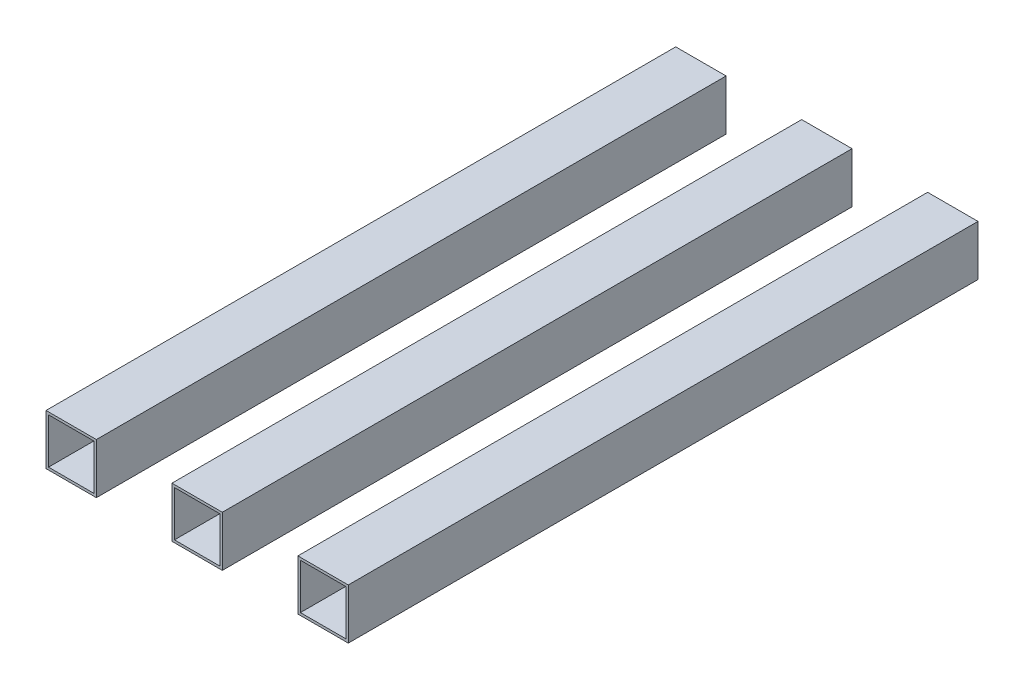
ISO-10303-21;
HEADER;
FILE_DESCRIPTION(('STEP AP214'),'2;1');
FILE_NAME('part.step','',(''),(''),'','','');
FILE_SCHEMA(('AUTOMOTIVE_DESIGN { 1 0 10303 214 1 1 1 1 }'));
ENDSEC;
DATA;
#1=APPLICATION_CONTEXT('core data for automotive mechanical design processes');
#2=APPLICATION_PROTOCOL_DEFINITION('international standard','automotive_design',2000,#1);
#3=PRODUCT_CONTEXT('',#1,'mechanical');
#4=PRODUCT('Part','Part','',(#3));
#5=PRODUCT_RELATED_PRODUCT_CATEGORY('part','',(#4));
#6=PRODUCT_DEFINITION_FORMATION('','',#4);
#7=PRODUCT_DEFINITION_CONTEXT('part definition',#1,'design');
#8=PRODUCT_DEFINITION('design','',#6,#7);
#9=PRODUCT_DEFINITION_SHAPE('','',#8);
#10=(LENGTH_UNIT() NAMED_UNIT(*) SI_UNIT(.MILLI.,.METRE.));
#11=(NAMED_UNIT(*) PLANE_ANGLE_UNIT() SI_UNIT($,.RADIAN.));
#12=(NAMED_UNIT(*) SI_UNIT($,.STERADIAN.) SOLID_ANGLE_UNIT());
#13=UNCERTAINTY_MEASURE_WITH_UNIT(LENGTH_MEASURE(1.E-05),#10,'distance_accuracy_value','');
#14=(GEOMETRIC_REPRESENTATION_CONTEXT(3) GLOBAL_UNCERTAINTY_ASSIGNED_CONTEXT((#13)) GLOBAL_UNIT_ASSIGNED_CONTEXT((#10,
#11,#12)) REPRESENTATION_CONTEXT('',''));
#15=CARTESIAN_POINT('',(0.,0.,0.));
#16=DIRECTION('',(0.,0.,1.));
#17=DIRECTION('',(1.,0.,0.));
#18=AXIS2_PLACEMENT_3D('',#15,#16,#17);
#19=CARTESIAN_POINT('',(0.,0.,500.));
#20=DIRECTION('',(0.,0.,-1.));
#21=DIRECTION('',(-1.,0.,0.));
#22=AXIS2_PLACEMENT_3D('',#19,#20,#21);
#23=PLANE('',#22);
#24=DIRECTION('',(0.,-1.,0.));
#25=VECTOR('',#24,1.);
#26=CARTESIAN_POINT('',(80.,-20.,500.));
#27=LINE('',#26,#25);
#28=CARTESIAN_POINT('',(80.,20.,500.));
#29=VERTEX_POINT('',#28);
#30=CARTESIAN_POINT('',(80.,-20.,500.));
#31=VERTEX_POINT('',#30);
#32=EDGE_CURVE('E151',#29,#31,#27,.T.);
#33=ORIENTED_EDGE('',*,*,#32,.T.);
#34=DIRECTION('',(1.,0.,0.));
#35=VECTOR('',#34,1.);
#36=CARTESIAN_POINT('',(80.,-20.,500.));
#37=LINE('',#36,#35);
#38=CARTESIAN_POINT('',(120.,-20.,500.));
#39=VERTEX_POINT('',#38);
#40=EDGE_CURVE('E154',#31,#39,#37,.T.);
#41=ORIENTED_EDGE('',*,*,#40,.T.);
#42=DIRECTION('',(0.,1.,0.));
#43=VECTOR('',#42,1.);
#44=CARTESIAN_POINT('',(120.,-20.,500.));
#45=LINE('',#44,#43);
#46=CARTESIAN_POINT('',(120.,20.,500.));
#47=VERTEX_POINT('',#46);
#48=EDGE_CURVE('E157',#39,#47,#45,.T.);
#49=ORIENTED_EDGE('',*,*,#48,.T.);
#50=DIRECTION('',(-1.,0.,0.));
#51=VECTOR('',#50,1.);
#52=CARTESIAN_POINT('',(80.,20.,500.));
#53=LINE('',#52,#51);
#54=EDGE_CURVE('E159',#47,#29,#53,.T.);
#55=ORIENTED_EDGE('',*,*,#54,.T.);
#56=EDGE_LOOP('',(#33,#41,#49,#55));
#57=FACE_BOUND('',#56,.T.);
#58=DIRECTION('',(0.,-1.,0.));
#59=VECTOR('',#58,1.);
#60=CARTESIAN_POINT('',(82.,-18.,500.));
#61=LINE('',#60,#59);
#62=CARTESIAN_POINT('',(82.,18.,500.));
#63=VERTEX_POINT('',#62);
#64=CARTESIAN_POINT('',(82.,-18.,500.));
#65=VERTEX_POINT('',#64);
#66=EDGE_CURVE('E115',#63,#65,#61,.T.);
#67=ORIENTED_EDGE('',*,*,#66,.F.);
#68=DIRECTION('',(-1.,0.,0.));
#69=VECTOR('',#68,1.);
#70=CARTESIAN_POINT('',(82.,18.,500.));
#71=LINE('',#70,#69);
#72=CARTESIAN_POINT('',(118.,18.,500.));
#73=VERTEX_POINT('',#72);
#74=EDGE_CURVE('E137',#73,#63,#71,.T.);
#75=ORIENTED_EDGE('',*,*,#74,.F.);
#76=DIRECTION('',(0.,1.,0.));
#77=VECTOR('',#76,1.);
#78=CARTESIAN_POINT('',(118.,-18.,500.));
#79=LINE('',#78,#77);
#80=CARTESIAN_POINT('',(118.,-18.,500.));
#81=VERTEX_POINT('',#80);
#82=EDGE_CURVE('E135',#81,#73,#79,.T.);
#83=ORIENTED_EDGE('',*,*,#82,.F.);
#84=DIRECTION('',(1.,0.,0.));
#85=VECTOR('',#84,1.);
#86=CARTESIAN_POINT('',(82.,-18.,500.));
#87=LINE('',#86,#85);
#88=EDGE_CURVE('E123',#65,#81,#87,.T.);
#89=ORIENTED_EDGE('',*,*,#88,.F.);
#90=EDGE_LOOP('',(#67,#75,#83,#89));
#91=FACE_BOUND('',#90,.T.);
#92=ADVANCED_FACE('F50',(#57,#91),#23,.F.);
#93=CARTESIAN_POINT('',(0.,0.,0.));
#94=DIRECTION('',(0.,0.,-1.));
#95=DIRECTION('',(-1.,0.,0.));
#96=AXIS2_PLACEMENT_3D('',#93,#94,#95);
#97=PLANE('',#96);
#98=DIRECTION('',(0.,-1.,0.));
#99=VECTOR('',#98,1.);
#100=CARTESIAN_POINT('',(80.,-20.,0.));
#101=LINE('',#100,#99);
#102=CARTESIAN_POINT('',(80.,20.,0.));
#103=VERTEX_POINT('',#102);
#104=CARTESIAN_POINT('',(80.,-20.,0.));
#105=VERTEX_POINT('',#104);
#106=EDGE_CURVE('E131',#103,#105,#101,.T.);
#107=ORIENTED_EDGE('',*,*,#106,.F.);
#108=DIRECTION('',(-1.,0.,0.));
#109=VECTOR('',#108,1.);
#110=CARTESIAN_POINT('',(80.,20.,0.));
#111=LINE('',#110,#109);
#112=CARTESIAN_POINT('',(120.,20.,0.));
#113=VERTEX_POINT('',#112);
#114=EDGE_CURVE('E155',#113,#103,#111,.T.);
#115=ORIENTED_EDGE('',*,*,#114,.F.);
#116=DIRECTION('',(0.,1.,0.));
#117=VECTOR('',#116,1.);
#118=CARTESIAN_POINT('',(120.,-20.,0.));
#119=LINE('',#118,#117);
#120=CARTESIAN_POINT('',(120.,-20.,0.));
#121=VERTEX_POINT('',#120);
#122=EDGE_CURVE('E166',#121,#113,#119,.T.);
#123=ORIENTED_EDGE('',*,*,#122,.F.);
#124=DIRECTION('',(1.,0.,0.));
#125=VECTOR('',#124,1.);
#126=CARTESIAN_POINT('',(80.,-20.,0.));
#127=LINE('',#126,#125);
#128=EDGE_CURVE('E164',#105,#121,#127,.T.);
#129=ORIENTED_EDGE('',*,*,#128,.F.);
#130=EDGE_LOOP('',(#107,#115,#123,#129));
#131=FACE_BOUND('',#130,.T.);
#132=DIRECTION('',(-1.,0.,0.));
#133=VECTOR('',#132,1.);
#134=CARTESIAN_POINT('',(82.,18.,0.));
#135=LINE('',#134,#133);
#136=CARTESIAN_POINT('',(118.,18.,0.));
#137=VERTEX_POINT('',#136);
#138=CARTESIAN_POINT('',(82.,18.,0.));
#139=VERTEX_POINT('',#138);
#140=EDGE_CURVE('E124',#137,#139,#135,.T.);
#141=ORIENTED_EDGE('',*,*,#140,.T.);
#142=DIRECTION('',(0.,-1.,0.));
#143=VECTOR('',#142,1.);
#144=CARTESIAN_POINT('',(82.,-18.,0.));
#145=LINE('',#144,#143);
#146=CARTESIAN_POINT('',(82.,-18.,0.));
#147=VERTEX_POINT('',#146);
#148=EDGE_CURVE('E73',#139,#147,#145,.T.);
#149=ORIENTED_EDGE('',*,*,#148,.T.);
#150=DIRECTION('',(1.,0.,0.));
#151=VECTOR('',#150,1.);
#152=CARTESIAN_POINT('',(82.,-18.,0.));
#153=LINE('',#152,#151);
#154=CARTESIAN_POINT('',(118.,-18.,0.));
#155=VERTEX_POINT('',#154);
#156=EDGE_CURVE('E130',#147,#155,#153,.T.);
#157=ORIENTED_EDGE('',*,*,#156,.T.);
#158=DIRECTION('',(0.,1.,0.));
#159=VECTOR('',#158,1.);
#160=CARTESIAN_POINT('',(118.,-18.,0.));
#161=LINE('',#160,#159);
#162=EDGE_CURVE('E143',#155,#137,#161,.T.);
#163=ORIENTED_EDGE('',*,*,#162,.T.);
#164=EDGE_LOOP('',(#141,#149,#157,#163));
#165=FACE_BOUND('',#164,.T.);
#166=ADVANCED_FACE('F184',(#131,#165),#97,.T.);
#167=CARTESIAN_POINT('',(80.,-20.,500.));
#168=DIRECTION('',(1.,0.,0.));
#169=DIRECTION('',(0.,0.,-1.));
#170=AXIS2_PLACEMENT_3D('',#167,#168,#169);
#171=PLANE('',#170);
#172=ORIENTED_EDGE('',*,*,#106,.T.);
#173=DIRECTION('',(0.,0.,-1.));
#174=VECTOR('',#173,1.);
#175=CARTESIAN_POINT('',(80.,-20.,500.));
#176=LINE('',#175,#174);
#177=EDGE_CURVE('E12',#31,#105,#176,.T.);
#178=ORIENTED_EDGE('',*,*,#177,.F.);
#179=ORIENTED_EDGE('',*,*,#32,.F.);
#180=DIRECTION('',(0.,0.,-1.));
#181=VECTOR('',#180,1.);
#182=CARTESIAN_POINT('',(80.,20.,500.));
#183=LINE('',#182,#181);
#184=EDGE_CURVE('E161',#29,#103,#183,.T.);
#185=ORIENTED_EDGE('',*,*,#184,.T.);
#186=EDGE_LOOP('',(#172,#178,#179,#185));
#187=FACE_BOUND('',#186,.T.);
#188=ADVANCED_FACE('F52',(#187),#171,.F.);
#189=CARTESIAN_POINT('',(80.,-20.,500.));
#190=DIRECTION('',(0.,1.,0.));
#191=DIRECTION('',(0.,0.,1.));
#192=AXIS2_PLACEMENT_3D('',#189,#190,#191);
#193=PLANE('',#192);
#194=ORIENTED_EDGE('',*,*,#128,.T.);
#195=DIRECTION('',(0.,0.,-1.));
#196=VECTOR('',#195,1.);
#197=CARTESIAN_POINT('',(120.,-20.,500.));
#198=LINE('',#197,#196);
#199=EDGE_CURVE('E58',#39,#121,#198,.T.);
#200=ORIENTED_EDGE('',*,*,#199,.F.);
#201=ORIENTED_EDGE('',*,*,#40,.F.);
#202=ORIENTED_EDGE('',*,*,#177,.T.);
#203=EDGE_LOOP('',(#194,#200,#201,#202));
#204=FACE_BOUND('',#203,.T.);
#205=ADVANCED_FACE('F194',(#204),#193,.F.);
#206=CARTESIAN_POINT('',(120.,-20.,500.));
#207=DIRECTION('',(-1.,0.,0.));
#208=DIRECTION('',(0.,0.,1.));
#209=AXIS2_PLACEMENT_3D('',#206,#207,#208);
#210=PLANE('',#209);
#211=ORIENTED_EDGE('',*,*,#122,.T.);
#212=DIRECTION('',(0.,0.,-1.));
#213=VECTOR('',#212,1.);
#214=CARTESIAN_POINT('',(120.,20.,500.));
#215=LINE('',#214,#213);
#216=EDGE_CURVE('E171',#47,#113,#215,.T.);
#217=ORIENTED_EDGE('',*,*,#216,.F.);
#218=ORIENTED_EDGE('',*,*,#48,.F.);
#219=ORIENTED_EDGE('',*,*,#199,.T.);
#220=EDGE_LOOP('',(#211,#217,#218,#219));
#221=FACE_BOUND('',#220,.T.);
#222=ADVANCED_FACE('F178',(#221),#210,.F.);
#223=CARTESIAN_POINT('',(80.,20.,500.));
#224=DIRECTION('',(0.,-1.,0.));
#225=DIRECTION('',(0.,0.,-1.));
#226=AXIS2_PLACEMENT_3D('',#223,#224,#225);
#227=PLANE('',#226);
#228=ORIENTED_EDGE('',*,*,#114,.T.);
#229=ORIENTED_EDGE('',*,*,#184,.F.);
#230=ORIENTED_EDGE('',*,*,#54,.F.);
#231=ORIENTED_EDGE('',*,*,#216,.T.);
#232=EDGE_LOOP('',(#228,#229,#230,#231));
#233=FACE_BOUND('',#232,.T.);
#234=ADVANCED_FACE('F188',(#233),#227,.F.);
#235=CARTESIAN_POINT('',(82.,-18.,500.));
#236=DIRECTION('',(1.,0.,0.));
#237=DIRECTION('',(0.,0.,-1.));
#238=AXIS2_PLACEMENT_3D('',#235,#236,#237);
#239=PLANE('',#238);
#240=ORIENTED_EDGE('',*,*,#148,.F.);
#241=DIRECTION('',(0.,0.,-1.));
#242=VECTOR('',#241,1.);
#243=CARTESIAN_POINT('',(82.,18.,500.));
#244=LINE('',#243,#242);
#245=EDGE_CURVE('E119',#63,#139,#244,.T.);
#246=ORIENTED_EDGE('',*,*,#245,.F.);
#247=ORIENTED_EDGE('',*,*,#66,.T.);
#248=DIRECTION('',(0.,0.,-1.));
#249=VECTOR('',#248,1.);
#250=CARTESIAN_POINT('',(82.,-18.,500.));
#251=LINE('',#250,#249);
#252=EDGE_CURVE('E118',#65,#147,#251,.T.);
#253=ORIENTED_EDGE('',*,*,#252,.T.);
#254=EDGE_LOOP('',(#240,#246,#247,#253));
#255=FACE_BOUND('',#254,.T.);
#256=ADVANCED_FACE('F117',(#255),#239,.T.);
#257=CARTESIAN_POINT('',(82.,-18.,500.));
#258=DIRECTION('',(0.,1.,0.));
#259=DIRECTION('',(0.,0.,1.));
#260=AXIS2_PLACEMENT_3D('',#257,#258,#259);
#261=PLANE('',#260);
#262=ORIENTED_EDGE('',*,*,#156,.F.);
#263=ORIENTED_EDGE('',*,*,#252,.F.);
#264=ORIENTED_EDGE('',*,*,#88,.T.);
#265=DIRECTION('',(0.,0.,-1.));
#266=VECTOR('',#265,1.);
#267=CARTESIAN_POINT('',(118.,-18.,500.));
#268=LINE('',#267,#266);
#269=EDGE_CURVE('E132',#81,#155,#268,.T.);
#270=ORIENTED_EDGE('',*,*,#269,.T.);
#271=EDGE_LOOP('',(#262,#263,#264,#270));
#272=FACE_BOUND('',#271,.T.);
#273=ADVANCED_FACE('F127',(#272),#261,.T.);
#274=CARTESIAN_POINT('',(118.,-18.,500.));
#275=DIRECTION('',(-1.,0.,0.));
#276=DIRECTION('',(0.,0.,1.));
#277=AXIS2_PLACEMENT_3D('',#274,#275,#276);
#278=PLANE('',#277);
#279=ORIENTED_EDGE('',*,*,#162,.F.);
#280=ORIENTED_EDGE('',*,*,#269,.F.);
#281=ORIENTED_EDGE('',*,*,#82,.T.);
#282=DIRECTION('',(0.,0.,-1.));
#283=VECTOR('',#282,1.);
#284=CARTESIAN_POINT('',(118.,18.,500.));
#285=LINE('',#284,#283);
#286=EDGE_CURVE('E65',#73,#137,#285,.T.);
#287=ORIENTED_EDGE('',*,*,#286,.T.);
#288=EDGE_LOOP('',(#279,#280,#281,#287));
#289=FACE_BOUND('',#288,.T.);
#290=ADVANCED_FACE('F217',(#289),#278,.T.);
#291=CARTESIAN_POINT('',(82.,18.,500.));
#292=DIRECTION('',(0.,-1.,0.));
#293=DIRECTION('',(0.,0.,-1.));
#294=AXIS2_PLACEMENT_3D('',#291,#292,#293);
#295=PLANE('',#294);
#296=ORIENTED_EDGE('',*,*,#140,.F.);
#297=ORIENTED_EDGE('',*,*,#286,.F.);
#298=ORIENTED_EDGE('',*,*,#74,.T.);
#299=ORIENTED_EDGE('',*,*,#245,.T.);
#300=EDGE_LOOP('',(#296,#297,#298,#299));
#301=FACE_BOUND('',#300,.T.);
#302=ADVANCED_FACE('F221',(#301),#295,.T.);
#303=CLOSED_SHELL('',(#92,#166,#188,#205,#222,#234,#256,#273,#290,#302));
#304=MANIFOLD_SOLID_BREP('B2',#303);
#305=CARTESIAN_POINT('',(0.,0.,500.));
#306=DIRECTION('',(0.,0.,-1.));
#307=DIRECTION('',(-1.,0.,0.));
#308=AXIS2_PLACEMENT_3D('',#305,#306,#307);
#309=PLANE('',#308);
#310=DIRECTION('',(0.,-1.,0.));
#311=VECTOR('',#310,1.);
#312=CARTESIAN_POINT('',(-20.,-20.,500.));
#313=LINE('',#312,#311);
#314=CARTESIAN_POINT('',(-20.,20.,500.));
#315=VERTEX_POINT('',#314);
#316=CARTESIAN_POINT('',(-20.,-20.,500.));
#317=VERTEX_POINT('',#316);
#318=EDGE_CURVE('E390',#315,#317,#313,.T.);
#319=ORIENTED_EDGE('',*,*,#318,.T.);
#320=DIRECTION('',(1.,0.,0.));
#321=VECTOR('',#320,1.);
#322=CARTESIAN_POINT('',(-20.,-20.,500.));
#323=LINE('',#322,#321);
#324=CARTESIAN_POINT('',(20.,-20.,500.));
#325=VERTEX_POINT('',#324);
#326=EDGE_CURVE('E393',#317,#325,#323,.T.);
#327=ORIENTED_EDGE('',*,*,#326,.T.);
#328=DIRECTION('',(0.,1.,0.));
#329=VECTOR('',#328,1.);
#330=CARTESIAN_POINT('',(20.,-20.,500.));
#331=LINE('',#330,#329);
#332=CARTESIAN_POINT('',(20.,20.,500.));
#333=VERTEX_POINT('',#332);
#334=EDGE_CURVE('E396',#325,#333,#331,.T.);
#335=ORIENTED_EDGE('',*,*,#334,.T.);
#336=DIRECTION('',(-1.,0.,0.));
#337=VECTOR('',#336,1.);
#338=CARTESIAN_POINT('',(-20.,20.,500.));
#339=LINE('',#338,#337);
#340=EDGE_CURVE('E398',#333,#315,#339,.T.);
#341=ORIENTED_EDGE('',*,*,#340,.T.);
#342=EDGE_LOOP('',(#319,#327,#335,#341));
#343=FACE_BOUND('',#342,.T.);
#344=DIRECTION('',(0.,-1.,0.));
#345=VECTOR('',#344,1.);
#346=CARTESIAN_POINT('',(-18.,-18.,500.));
#347=LINE('',#346,#345);
#348=CARTESIAN_POINT('',(-18.,18.,500.));
#349=VERTEX_POINT('',#348);
#350=CARTESIAN_POINT('',(-18.,-18.,500.));
#351=VERTEX_POINT('',#350);
#352=EDGE_CURVE('E354',#349,#351,#347,.T.);
#353=ORIENTED_EDGE('',*,*,#352,.F.);
#354=DIRECTION('',(-1.,0.,0.));
#355=VECTOR('',#354,1.);
#356=CARTESIAN_POINT('',(-18.,18.,500.));
#357=LINE('',#356,#355);
#358=CARTESIAN_POINT('',(18.,18.,500.));
#359=VERTEX_POINT('',#358);
#360=EDGE_CURVE('E376',#359,#349,#357,.T.);
#361=ORIENTED_EDGE('',*,*,#360,.F.);
#362=DIRECTION('',(0.,1.,0.));
#363=VECTOR('',#362,1.);
#364=CARTESIAN_POINT('',(18.,-18.,500.));
#365=LINE('',#364,#363);
#366=CARTESIAN_POINT('',(18.,-18.,500.));
#367=VERTEX_POINT('',#366);
#368=EDGE_CURVE('E374',#367,#359,#365,.T.);
#369=ORIENTED_EDGE('',*,*,#368,.F.);
#370=DIRECTION('',(1.,0.,0.));
#371=VECTOR('',#370,1.);
#372=CARTESIAN_POINT('',(-18.,-18.,500.));
#373=LINE('',#372,#371);
#374=EDGE_CURVE('E362',#351,#367,#373,.T.);
#375=ORIENTED_EDGE('',*,*,#374,.F.);
#376=EDGE_LOOP('',(#353,#361,#369,#375));
#377=FACE_BOUND('',#376,.T.);
#378=ADVANCED_FACE('F289',(#343,#377),#309,.F.);
#379=CARTESIAN_POINT('',(0.,0.,0.));
#380=DIRECTION('',(0.,0.,-1.));
#381=DIRECTION('',(-1.,0.,0.));
#382=AXIS2_PLACEMENT_3D('',#379,#380,#381);
#383=PLANE('',#382);
#384=DIRECTION('',(0.,-1.,0.));
#385=VECTOR('',#384,1.);
#386=CARTESIAN_POINT('',(-20.,-20.,0.));
#387=LINE('',#386,#385);
#388=CARTESIAN_POINT('',(-20.,20.,0.));
#389=VERTEX_POINT('',#388);
#390=CARTESIAN_POINT('',(-20.,-20.,0.));
#391=VERTEX_POINT('',#390);
#392=EDGE_CURVE('E370',#389,#391,#387,.T.);
#393=ORIENTED_EDGE('',*,*,#392,.F.);
#394=DIRECTION('',(-1.,0.,0.));
#395=VECTOR('',#394,1.);
#396=CARTESIAN_POINT('',(-20.,20.,0.));
#397=LINE('',#396,#395);
#398=CARTESIAN_POINT('',(20.,20.,0.));
#399=VERTEX_POINT('',#398);
#400=EDGE_CURVE('E394',#399,#389,#397,.T.);
#401=ORIENTED_EDGE('',*,*,#400,.F.);
#402=DIRECTION('',(0.,1.,0.));
#403=VECTOR('',#402,1.);
#404=CARTESIAN_POINT('',(20.,-20.,0.));
#405=LINE('',#404,#403);
#406=CARTESIAN_POINT('',(20.,-20.,0.));
#407=VERTEX_POINT('',#406);
#408=EDGE_CURVE('E405',#407,#399,#405,.T.);
#409=ORIENTED_EDGE('',*,*,#408,.F.);
#410=DIRECTION('',(1.,0.,0.));
#411=VECTOR('',#410,1.);
#412=CARTESIAN_POINT('',(-20.,-20.,0.));
#413=LINE('',#412,#411);
#414=EDGE_CURVE('E403',#391,#407,#413,.T.);
#415=ORIENTED_EDGE('',*,*,#414,.F.);
#416=EDGE_LOOP('',(#393,#401,#409,#415));
#417=FACE_BOUND('',#416,.T.);
#418=DIRECTION('',(-1.,0.,0.));
#419=VECTOR('',#418,1.);
#420=CARTESIAN_POINT('',(-18.,18.,0.));
#421=LINE('',#420,#419);
#422=CARTESIAN_POINT('',(18.,18.,0.));
#423=VERTEX_POINT('',#422);
#424=CARTESIAN_POINT('',(-18.,18.,0.));
#425=VERTEX_POINT('',#424);
#426=EDGE_CURVE('E363',#423,#425,#421,.T.);
#427=ORIENTED_EDGE('',*,*,#426,.T.);
#428=DIRECTION('',(0.,-1.,0.));
#429=VECTOR('',#428,1.);
#430=CARTESIAN_POINT('',(-18.,-18.,0.));
#431=LINE('',#430,#429);
#432=CARTESIAN_POINT('',(-18.,-18.,0.));
#433=VERTEX_POINT('',#432);
#434=EDGE_CURVE('E312',#425,#433,#431,.T.);
#435=ORIENTED_EDGE('',*,*,#434,.T.);
#436=DIRECTION('',(1.,0.,0.));
#437=VECTOR('',#436,1.);
#438=CARTESIAN_POINT('',(-18.,-18.,0.));
#439=LINE('',#438,#437);
#440=CARTESIAN_POINT('',(18.,-18.,0.));
#441=VERTEX_POINT('',#440);
#442=EDGE_CURVE('E369',#433,#441,#439,.T.);
#443=ORIENTED_EDGE('',*,*,#442,.T.);
#444=DIRECTION('',(0.,1.,0.));
#445=VECTOR('',#444,1.);
#446=CARTESIAN_POINT('',(18.,-18.,0.));
#447=LINE('',#446,#445);
#448=EDGE_CURVE('E382',#441,#423,#447,.T.);
#449=ORIENTED_EDGE('',*,*,#448,.T.);
#450=EDGE_LOOP('',(#427,#435,#443,#449));
#451=FACE_BOUND('',#450,.T.);
#452=ADVANCED_FACE('F423',(#417,#451),#383,.T.);
#453=CARTESIAN_POINT('',(-20.,-20.,500.));
#454=DIRECTION('',(1.,0.,0.));
#455=DIRECTION('',(0.,0.,-1.));
#456=AXIS2_PLACEMENT_3D('',#453,#454,#455);
#457=PLANE('',#456);
#458=ORIENTED_EDGE('',*,*,#392,.T.);
#459=DIRECTION('',(0.,0.,-1.));
#460=VECTOR('',#459,1.);
#461=CARTESIAN_POINT('',(-20.,-20.,500.));
#462=LINE('',#461,#460);
#463=EDGE_CURVE('E48',#317,#391,#462,.T.);
#464=ORIENTED_EDGE('',*,*,#463,.F.);
#465=ORIENTED_EDGE('',*,*,#318,.F.);
#466=DIRECTION('',(0.,0.,-1.));
#467=VECTOR('',#466,1.);
#468=CARTESIAN_POINT('',(-20.,20.,500.));
#469=LINE('',#468,#467);
#470=EDGE_CURVE('E400',#315,#389,#469,.T.);
#471=ORIENTED_EDGE('',*,*,#470,.T.);
#472=EDGE_LOOP('',(#458,#464,#465,#471));
#473=FACE_BOUND('',#472,.T.);
#474=ADVANCED_FACE('F291',(#473),#457,.F.);
#475=CARTESIAN_POINT('',(-20.,-20.,500.));
#476=DIRECTION('',(0.,1.,0.));
#477=DIRECTION('',(0.,0.,1.));
#478=AXIS2_PLACEMENT_3D('',#475,#476,#477);
#479=PLANE('',#478);
#480=ORIENTED_EDGE('',*,*,#414,.T.);
#481=DIRECTION('',(0.,0.,-1.));
#482=VECTOR('',#481,1.);
#483=CARTESIAN_POINT('',(20.,-20.,500.));
#484=LINE('',#483,#482);
#485=EDGE_CURVE('E297',#325,#407,#484,.T.);
#486=ORIENTED_EDGE('',*,*,#485,.F.);
#487=ORIENTED_EDGE('',*,*,#326,.F.);
#488=ORIENTED_EDGE('',*,*,#463,.T.);
#489=EDGE_LOOP('',(#480,#486,#487,#488));
#490=FACE_BOUND('',#489,.T.);
#491=ADVANCED_FACE('F433',(#490),#479,.F.);
#492=CARTESIAN_POINT('',(20.,-20.,500.));
#493=DIRECTION('',(-1.,0.,0.));
#494=DIRECTION('',(0.,0.,1.));
#495=AXIS2_PLACEMENT_3D('',#492,#493,#494);
#496=PLANE('',#495);
#497=ORIENTED_EDGE('',*,*,#408,.T.);
#498=DIRECTION('',(0.,0.,-1.));
#499=VECTOR('',#498,1.);
#500=CARTESIAN_POINT('',(20.,20.,500.));
#501=LINE('',#500,#499);
#502=EDGE_CURVE('E410',#333,#399,#501,.T.);
#503=ORIENTED_EDGE('',*,*,#502,.F.);
#504=ORIENTED_EDGE('',*,*,#334,.F.);
#505=ORIENTED_EDGE('',*,*,#485,.T.);
#506=EDGE_LOOP('',(#497,#503,#504,#505));
#507=FACE_BOUND('',#506,.T.);
#508=ADVANCED_FACE('F417',(#507),#496,.F.);
#509=CARTESIAN_POINT('',(-20.,20.,500.));
#510=DIRECTION('',(0.,-1.,0.));
#511=DIRECTION('',(0.,0.,-1.));
#512=AXIS2_PLACEMENT_3D('',#509,#510,#511);
#513=PLANE('',#512);
#514=ORIENTED_EDGE('',*,*,#400,.T.);
#515=ORIENTED_EDGE('',*,*,#470,.F.);
#516=ORIENTED_EDGE('',*,*,#340,.F.);
#517=ORIENTED_EDGE('',*,*,#502,.T.);
#518=EDGE_LOOP('',(#514,#515,#516,#517));
#519=FACE_BOUND('',#518,.T.);
#520=ADVANCED_FACE('F427',(#519),#513,.F.);
#521=CARTESIAN_POINT('',(-18.,-18.,500.));
#522=DIRECTION('',(1.,0.,0.));
#523=DIRECTION('',(0.,0.,-1.));
#524=AXIS2_PLACEMENT_3D('',#521,#522,#523);
#525=PLANE('',#524);
#526=ORIENTED_EDGE('',*,*,#434,.F.);
#527=DIRECTION('',(0.,0.,-1.));
#528=VECTOR('',#527,1.);
#529=CARTESIAN_POINT('',(-18.,18.,500.));
#530=LINE('',#529,#528);
#531=EDGE_CURVE('E358',#349,#425,#530,.T.);
#532=ORIENTED_EDGE('',*,*,#531,.F.);
#533=ORIENTED_EDGE('',*,*,#352,.T.);
#534=DIRECTION('',(0.,0.,-1.));
#535=VECTOR('',#534,1.);
#536=CARTESIAN_POINT('',(-18.,-18.,500.));
#537=LINE('',#536,#535);
#538=EDGE_CURVE('E357',#351,#433,#537,.T.);
#539=ORIENTED_EDGE('',*,*,#538,.T.);
#540=EDGE_LOOP('',(#526,#532,#533,#539));
#541=FACE_BOUND('',#540,.T.);
#542=ADVANCED_FACE('F356',(#541),#525,.T.);
#543=CARTESIAN_POINT('',(-18.,-18.,500.));
#544=DIRECTION('',(0.,1.,0.));
#545=DIRECTION('',(0.,0.,1.));
#546=AXIS2_PLACEMENT_3D('',#543,#544,#545);
#547=PLANE('',#546);
#548=ORIENTED_EDGE('',*,*,#442,.F.);
#549=ORIENTED_EDGE('',*,*,#538,.F.);
#550=ORIENTED_EDGE('',*,*,#374,.T.);
#551=DIRECTION('',(0.,0.,-1.));
#552=VECTOR('',#551,1.);
#553=CARTESIAN_POINT('',(18.,-18.,500.));
#554=LINE('',#553,#552);
#555=EDGE_CURVE('E371',#367,#441,#554,.T.);
#556=ORIENTED_EDGE('',*,*,#555,.T.);
#557=EDGE_LOOP('',(#548,#549,#550,#556));
#558=FACE_BOUND('',#557,.T.);
#559=ADVANCED_FACE('F366',(#558),#547,.T.);
#560=CARTESIAN_POINT('',(18.,-18.,500.));
#561=DIRECTION('',(-1.,0.,0.));
#562=DIRECTION('',(0.,0.,1.));
#563=AXIS2_PLACEMENT_3D('',#560,#561,#562);
#564=PLANE('',#563);
#565=ORIENTED_EDGE('',*,*,#448,.F.);
#566=ORIENTED_EDGE('',*,*,#555,.F.);
#567=ORIENTED_EDGE('',*,*,#368,.T.);
#568=DIRECTION('',(0.,0.,-1.));
#569=VECTOR('',#568,1.);
#570=CARTESIAN_POINT('',(18.,18.,500.));
#571=LINE('',#570,#569);
#572=EDGE_CURVE('E304',#359,#423,#571,.T.);
#573=ORIENTED_EDGE('',*,*,#572,.T.);
#574=EDGE_LOOP('',(#565,#566,#567,#573));
#575=FACE_BOUND('',#574,.T.);
#576=ADVANCED_FACE('F456',(#575),#564,.T.);
#577=CARTESIAN_POINT('',(-18.,18.,500.));
#578=DIRECTION('',(0.,-1.,0.));
#579=DIRECTION('',(0.,0.,-1.));
#580=AXIS2_PLACEMENT_3D('',#577,#578,#579);
#581=PLANE('',#580);
#582=ORIENTED_EDGE('',*,*,#426,.F.);
#583=ORIENTED_EDGE('',*,*,#572,.F.);
#584=ORIENTED_EDGE('',*,*,#360,.T.);
#585=ORIENTED_EDGE('',*,*,#531,.T.);
#586=EDGE_LOOP('',(#582,#583,#584,#585));
#587=FACE_BOUND('',#586,.T.);
#588=ADVANCED_FACE('F460',(#587),#581,.T.);
#589=CLOSED_SHELL('',(#378,#452,#474,#491,#508,#520,#542,#559,#576,#588));
#590=MANIFOLD_SOLID_BREP('B6',#589);
#591=CARTESIAN_POINT('',(0.,0.,500.));
#592=DIRECTION('',(0.,0.,-1.));
#593=DIRECTION('',(-1.,0.,0.));
#594=AXIS2_PLACEMENT_3D('',#591,#592,#593);
#595=PLANE('',#594);
#596=DIRECTION('',(0.,-1.,0.));
#597=VECTOR('',#596,1.);
#598=CARTESIAN_POINT('',(-120.,-20.,500.));
#599=LINE('',#598,#597);
#600=CARTESIAN_POINT('',(-120.,20.,500.));
#601=VERTEX_POINT('',#600);
#602=CARTESIAN_POINT('',(-120.,-20.,500.));
#603=VERTEX_POINT('',#602);
#604=EDGE_CURVE('E620',#601,#603,#599,.T.);
#605=ORIENTED_EDGE('',*,*,#604,.T.);
#606=DIRECTION('',(1.,0.,0.));
#607=VECTOR('',#606,1.);
#608=CARTESIAN_POINT('',(-120.,-20.,500.));
#609=LINE('',#608,#607);
#610=CARTESIAN_POINT('',(-80.,-20.,500.));
#611=VERTEX_POINT('',#610);
#612=EDGE_CURVE('E623',#603,#611,#609,.T.);
#613=ORIENTED_EDGE('',*,*,#612,.T.);
#614=DIRECTION('',(0.,1.,0.));
#615=VECTOR('',#614,1.);
#616=CARTESIAN_POINT('',(-80.,-20.,500.));
#617=LINE('',#616,#615);
#618=CARTESIAN_POINT('',(-80.,20.,500.));
#619=VERTEX_POINT('',#618);
#620=EDGE_CURVE('E626',#611,#619,#617,.T.);
#621=ORIENTED_EDGE('',*,*,#620,.T.);
#622=DIRECTION('',(-1.,0.,0.));
#623=VECTOR('',#622,1.);
#624=CARTESIAN_POINT('',(-120.,20.,500.));
#625=LINE('',#624,#623);
#626=EDGE_CURVE('E628',#619,#601,#625,.T.);
#627=ORIENTED_EDGE('',*,*,#626,.T.);
#628=EDGE_LOOP('',(#605,#613,#621,#627));
#629=FACE_BOUND('',#628,.T.);
#630=DIRECTION('',(0.,-1.,0.));
#631=VECTOR('',#630,1.);
#632=CARTESIAN_POINT('',(-118.,-18.,500.));
#633=LINE('',#632,#631);
#634=CARTESIAN_POINT('',(-118.,18.,500.));
#635=VERTEX_POINT('',#634);
#636=CARTESIAN_POINT('',(-118.,-18.,500.));
#637=VERTEX_POINT('',#636);
#638=EDGE_CURVE('E584',#635,#637,#633,.T.);
#639=ORIENTED_EDGE('',*,*,#638,.F.);
#640=DIRECTION('',(-1.,0.,0.));
#641=VECTOR('',#640,1.);
#642=CARTESIAN_POINT('',(-118.,18.,500.));
#643=LINE('',#642,#641);
#644=CARTESIAN_POINT('',(-82.,18.,500.));
#645=VERTEX_POINT('',#644);
#646=EDGE_CURVE('E606',#645,#635,#643,.T.);
#647=ORIENTED_EDGE('',*,*,#646,.F.);
#648=DIRECTION('',(0.,1.,0.));
#649=VECTOR('',#648,1.);
#650=CARTESIAN_POINT('',(-82.,-18.,500.));
#651=LINE('',#650,#649);
#652=CARTESIAN_POINT('',(-82.,-18.,500.));
#653=VERTEX_POINT('',#652);
#654=EDGE_CURVE('E604',#653,#645,#651,.T.);
#655=ORIENTED_EDGE('',*,*,#654,.F.);
#656=DIRECTION('',(1.,0.,0.));
#657=VECTOR('',#656,1.);
#658=CARTESIAN_POINT('',(-118.,-18.,500.));
#659=LINE('',#658,#657);
#660=EDGE_CURVE('E592',#637,#653,#659,.T.);
#661=ORIENTED_EDGE('',*,*,#660,.F.);
#662=EDGE_LOOP('',(#639,#647,#655,#661));
#663=FACE_BOUND('',#662,.T.);
#664=ADVANCED_FACE('F519',(#629,#663),#595,.F.);
#665=CARTESIAN_POINT('',(0.,0.,0.));
#666=DIRECTION('',(0.,0.,-1.));
#667=DIRECTION('',(-1.,0.,0.));
#668=AXIS2_PLACEMENT_3D('',#665,#666,#667);
#669=PLANE('',#668);
#670=DIRECTION('',(0.,-1.,0.));
#671=VECTOR('',#670,1.);
#672=CARTESIAN_POINT('',(-120.,-20.,0.));
#673=LINE('',#672,#671);
#674=CARTESIAN_POINT('',(-120.,20.,0.));
#675=VERTEX_POINT('',#674);
#676=CARTESIAN_POINT('',(-120.,-20.,0.));
#677=VERTEX_POINT('',#676);
#678=EDGE_CURVE('E600',#675,#677,#673,.T.);
#679=ORIENTED_EDGE('',*,*,#678,.F.);
#680=DIRECTION('',(-1.,0.,0.));
#681=VECTOR('',#680,1.);
#682=CARTESIAN_POINT('',(-120.,20.,0.));
#683=LINE('',#682,#681);
#684=CARTESIAN_POINT('',(-80.,20.,0.));
#685=VERTEX_POINT('',#684);
#686=EDGE_CURVE('E624',#685,#675,#683,.T.);
#687=ORIENTED_EDGE('',*,*,#686,.F.);
#688=DIRECTION('',(0.,1.,0.));
#689=VECTOR('',#688,1.);
#690=CARTESIAN_POINT('',(-80.,-20.,0.));
#691=LINE('',#690,#689);
#692=CARTESIAN_POINT('',(-80.,-20.,0.));
#693=VERTEX_POINT('',#692);
#694=EDGE_CURVE('E635',#693,#685,#691,.T.);
#695=ORIENTED_EDGE('',*,*,#694,.F.);
#696=DIRECTION('',(1.,0.,0.));
#697=VECTOR('',#696,1.);
#698=CARTESIAN_POINT('',(-120.,-20.,0.));
#699=LINE('',#698,#697);
#700=EDGE_CURVE('E633',#677,#693,#699,.T.);
#701=ORIENTED_EDGE('',*,*,#700,.F.);
#702=EDGE_LOOP('',(#679,#687,#695,#701));
#703=FACE_BOUND('',#702,.T.);
#704=DIRECTION('',(-1.,0.,0.));
#705=VECTOR('',#704,1.);
#706=CARTESIAN_POINT('',(-118.,18.,0.));
#707=LINE('',#706,#705);
#708=CARTESIAN_POINT('',(-82.,18.,0.));
#709=VERTEX_POINT('',#708);
#710=CARTESIAN_POINT('',(-118.,18.,0.));
#711=VERTEX_POINT('',#710);
#712=EDGE_CURVE('E593',#709,#711,#707,.T.);
#713=ORIENTED_EDGE('',*,*,#712,.T.);
#714=DIRECTION('',(0.,-1.,0.));
#715=VECTOR('',#714,1.);
#716=CARTESIAN_POINT('',(-118.,-18.,0.));
#717=LINE('',#716,#715);
#718=CARTESIAN_POINT('',(-118.,-18.,0.));
#719=VERTEX_POINT('',#718);
#720=EDGE_CURVE('E542',#711,#719,#717,.T.);
#721=ORIENTED_EDGE('',*,*,#720,.T.);
#722=DIRECTION('',(1.,0.,0.));
#723=VECTOR('',#722,1.);
#724=CARTESIAN_POINT('',(-118.,-18.,0.));
#725=LINE('',#724,#723);
#726=CARTESIAN_POINT('',(-82.,-18.,0.));
#727=VERTEX_POINT('',#726);
#728=EDGE_CURVE('E599',#719,#727,#725,.T.);
#729=ORIENTED_EDGE('',*,*,#728,.T.);
#730=DIRECTION('',(0.,1.,0.));
#731=VECTOR('',#730,1.);
#732=CARTESIAN_POINT('',(-82.,-18.,0.));
#733=LINE('',#732,#731);
#734=EDGE_CURVE('E612',#727,#709,#733,.T.);
#735=ORIENTED_EDGE('',*,*,#734,.T.);
#736=EDGE_LOOP('',(#713,#721,#729,#735));
#737=FACE_BOUND('',#736,.T.);
#738=ADVANCED_FACE('F653',(#703,#737),#669,.T.);
#739=CARTESIAN_POINT('',(-120.,-20.,500.));
#740=DIRECTION('',(1.,0.,0.));
#741=DIRECTION('',(0.,0.,-1.));
#742=AXIS2_PLACEMENT_3D('',#739,#740,#741);
#743=PLANE('',#742);
#744=ORIENTED_EDGE('',*,*,#678,.T.);
#745=DIRECTION('',(0.,0.,-1.));
#746=VECTOR('',#745,1.);
#747=CARTESIAN_POINT('',(-120.,-20.,500.));
#748=LINE('',#747,#746);
#749=EDGE_CURVE('E287',#603,#677,#748,.T.);
#750=ORIENTED_EDGE('',*,*,#749,.F.);
#751=ORIENTED_EDGE('',*,*,#604,.F.);
#752=DIRECTION('',(0.,0.,-1.));
#753=VECTOR('',#752,1.);
#754=CARTESIAN_POINT('',(-120.,20.,500.));
#755=LINE('',#754,#753);
#756=EDGE_CURVE('E630',#601,#675,#755,.T.);
#757=ORIENTED_EDGE('',*,*,#756,.T.);
#758=EDGE_LOOP('',(#744,#750,#751,#757));
#759=FACE_BOUND('',#758,.T.);
#760=ADVANCED_FACE('F521',(#759),#743,.F.);
#761=CARTESIAN_POINT('',(-120.,-20.,500.));
#762=DIRECTION('',(0.,1.,0.));
#763=DIRECTION('',(0.,0.,1.));
#764=AXIS2_PLACEMENT_3D('',#761,#762,#763);
#765=PLANE('',#764);
#766=ORIENTED_EDGE('',*,*,#700,.T.);
#767=DIRECTION('',(0.,0.,-1.));
#768=VECTOR('',#767,1.);
#769=CARTESIAN_POINT('',(-80.,-20.,500.));
#770=LINE('',#769,#768);
#771=EDGE_CURVE('E527',#611,#693,#770,.T.);
#772=ORIENTED_EDGE('',*,*,#771,.F.);
#773=ORIENTED_EDGE('',*,*,#612,.F.);
#774=ORIENTED_EDGE('',*,*,#749,.T.);
#775=EDGE_LOOP('',(#766,#772,#773,#774));
#776=FACE_BOUND('',#775,.T.);
#777=ADVANCED_FACE('F663',(#776),#765,.F.);
#778=CARTESIAN_POINT('',(-80.,-20.,500.));
#779=DIRECTION('',(-1.,0.,0.));
#780=DIRECTION('',(0.,0.,1.));
#781=AXIS2_PLACEMENT_3D('',#778,#779,#780);
#782=PLANE('',#781);
#783=ORIENTED_EDGE('',*,*,#694,.T.);
#784=DIRECTION('',(0.,0.,-1.));
#785=VECTOR('',#784,1.);
#786=CARTESIAN_POINT('',(-80.,20.,500.));
#787=LINE('',#786,#785);
#788=EDGE_CURVE('E640',#619,#685,#787,.T.);
#789=ORIENTED_EDGE('',*,*,#788,.F.);
#790=ORIENTED_EDGE('',*,*,#620,.F.);
#791=ORIENTED_EDGE('',*,*,#771,.T.);
#792=EDGE_LOOP('',(#783,#789,#790,#791));
#793=FACE_BOUND('',#792,.T.);
#794=ADVANCED_FACE('F647',(#793),#782,.F.);
#795=CARTESIAN_POINT('',(-120.,20.,500.));
#796=DIRECTION('',(0.,-1.,0.));
#797=DIRECTION('',(0.,0.,-1.));
#798=AXIS2_PLACEMENT_3D('',#795,#796,#797);
#799=PLANE('',#798);
#800=ORIENTED_EDGE('',*,*,#686,.T.);
#801=ORIENTED_EDGE('',*,*,#756,.F.);
#802=ORIENTED_EDGE('',*,*,#626,.F.);
#803=ORIENTED_EDGE('',*,*,#788,.T.);
#804=EDGE_LOOP('',(#800,#801,#802,#803));
#805=FACE_BOUND('',#804,.T.);
#806=ADVANCED_FACE('F657',(#805),#799,.F.);
#807=CARTESIAN_POINT('',(-118.,-18.,500.));
#808=DIRECTION('',(1.,0.,0.));
#809=DIRECTION('',(0.,0.,-1.));
#810=AXIS2_PLACEMENT_3D('',#807,#808,#809);
#811=PLANE('',#810);
#812=ORIENTED_EDGE('',*,*,#720,.F.);
#813=DIRECTION('',(0.,0.,-1.));
#814=VECTOR('',#813,1.);
#815=CARTESIAN_POINT('',(-118.,18.,500.));
#816=LINE('',#815,#814);
#817=EDGE_CURVE('E588',#635,#711,#816,.T.);
#818=ORIENTED_EDGE('',*,*,#817,.F.);
#819=ORIENTED_EDGE('',*,*,#638,.T.);
#820=DIRECTION('',(0.,0.,-1.));
#821=VECTOR('',#820,1.);
#822=CARTESIAN_POINT('',(-118.,-18.,500.));
#823=LINE('',#822,#821);
#824=EDGE_CURVE('E587',#637,#719,#823,.T.);
#825=ORIENTED_EDGE('',*,*,#824,.T.);
#826=EDGE_LOOP('',(#812,#818,#819,#825));
#827=FACE_BOUND('',#826,.T.);
#828=ADVANCED_FACE('F586',(#827),#811,.T.);
#829=CARTESIAN_POINT('',(-118.,-18.,500.));
#830=DIRECTION('',(0.,1.,0.));
#831=DIRECTION('',(0.,0.,1.));
#832=AXIS2_PLACEMENT_3D('',#829,#830,#831);
#833=PLANE('',#832);
#834=ORIENTED_EDGE('',*,*,#728,.F.);
#835=ORIENTED_EDGE('',*,*,#824,.F.);
#836=ORIENTED_EDGE('',*,*,#660,.T.);
#837=DIRECTION('',(0.,0.,-1.));
#838=VECTOR('',#837,1.);
#839=CARTESIAN_POINT('',(-82.,-18.,500.));
#840=LINE('',#839,#838);
#841=EDGE_CURVE('E601',#653,#727,#840,.T.);
#842=ORIENTED_EDGE('',*,*,#841,.T.);
#843=EDGE_LOOP('',(#834,#835,#836,#842));
#844=FACE_BOUND('',#843,.T.);
#845=ADVANCED_FACE('F596',(#844),#833,.T.);
#846=CARTESIAN_POINT('',(-82.,-18.,500.));
#847=DIRECTION('',(-1.,0.,0.));
#848=DIRECTION('',(0.,0.,1.));
#849=AXIS2_PLACEMENT_3D('',#846,#847,#848);
#850=PLANE('',#849);
#851=ORIENTED_EDGE('',*,*,#734,.F.);
#852=ORIENTED_EDGE('',*,*,#841,.F.);
#853=ORIENTED_EDGE('',*,*,#654,.T.);
#854=DIRECTION('',(0.,0.,-1.));
#855=VECTOR('',#854,1.);
#856=CARTESIAN_POINT('',(-82.,18.,500.));
#857=LINE('',#856,#855);
#858=EDGE_CURVE('E534',#645,#709,#857,.T.);
#859=ORIENTED_EDGE('',*,*,#858,.T.);
#860=EDGE_LOOP('',(#851,#852,#853,#859));
#861=FACE_BOUND('',#860,.T.);
#862=ADVANCED_FACE('F686',(#861),#850,.T.);
#863=CARTESIAN_POINT('',(-118.,18.,500.));
#864=DIRECTION('',(0.,-1.,0.));
#865=DIRECTION('',(0.,0.,-1.));
#866=AXIS2_PLACEMENT_3D('',#863,#864,#865);
#867=PLANE('',#866);
#868=ORIENTED_EDGE('',*,*,#712,.F.);
#869=ORIENTED_EDGE('',*,*,#858,.F.);
#870=ORIENTED_EDGE('',*,*,#646,.T.);
#871=ORIENTED_EDGE('',*,*,#817,.T.);
#872=EDGE_LOOP('',(#868,#869,#870,#871));
#873=FACE_BOUND('',#872,.T.);
#874=ADVANCED_FACE('F690',(#873),#867,.T.);
#875=CLOSED_SHELL('',(#664,#738,#760,#777,#794,#806,#828,#845,#862,#874));
#876=MANIFOLD_SOLID_BREP('B42',#875);
#877=ADVANCED_BREP_SHAPE_REPRESENTATION('',(#18,#304,#590,#876),#14);
#878=SHAPE_DEFINITION_REPRESENTATION(#9,#877);
ENDSEC;
END-ISO-10303-21;
